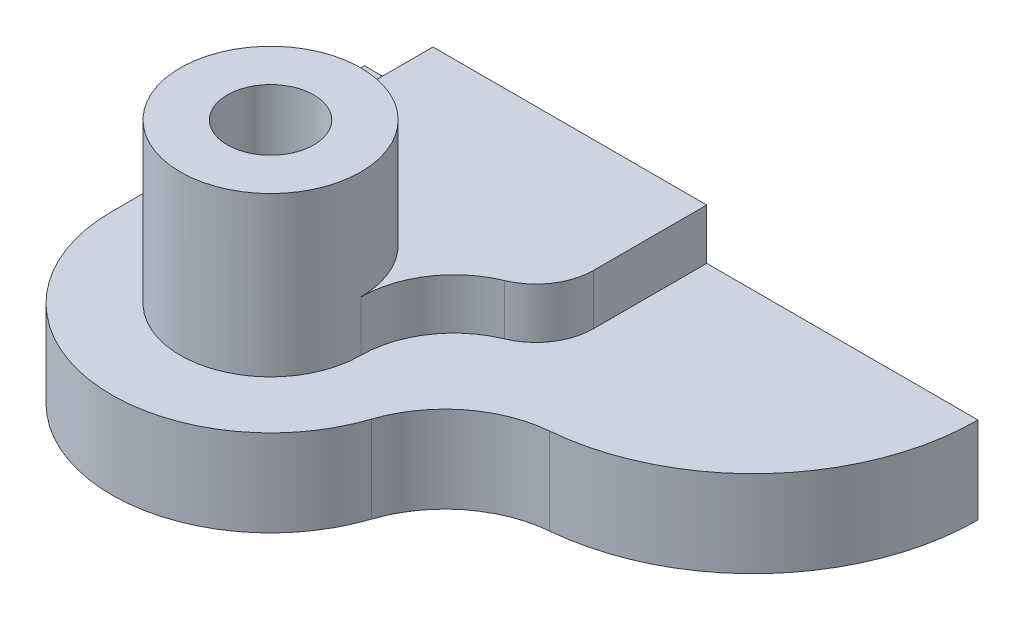
ISO-10303-21;
HEADER;
FILE_DESCRIPTION(('STEP AP214'),'2;1');
FILE_NAME('part.step','',(''),(''),'','','');
FILE_SCHEMA(('AUTOMOTIVE_DESIGN { 1 0 10303 214 1 1 1 1 }'));
ENDSEC;
DATA;
#1=APPLICATION_CONTEXT('core data for automotive mechanical design processes');
#2=APPLICATION_PROTOCOL_DEFINITION('international standard','automotive_design',2000,#1);
#3=PRODUCT_CONTEXT('',#1,'mechanical');
#4=PRODUCT('Part','Part','',(#3));
#5=PRODUCT_RELATED_PRODUCT_CATEGORY('part','',(#4));
#6=PRODUCT_DEFINITION_FORMATION('','',#4);
#7=PRODUCT_DEFINITION_CONTEXT('part definition',#1,'design');
#8=PRODUCT_DEFINITION('design','',#6,#7);
#9=PRODUCT_DEFINITION_SHAPE('','',#8);
#10=(LENGTH_UNIT() NAMED_UNIT(*) SI_UNIT(.MILLI.,.METRE.));
#11=(NAMED_UNIT(*) PLANE_ANGLE_UNIT() SI_UNIT($,.RADIAN.));
#12=(NAMED_UNIT(*) SI_UNIT($,.STERADIAN.) SOLID_ANGLE_UNIT());
#13=UNCERTAINTY_MEASURE_WITH_UNIT(LENGTH_MEASURE(1.E-05),#10,'distance_accuracy_value','');
#14=(GEOMETRIC_REPRESENTATION_CONTEXT(3) GLOBAL_UNCERTAINTY_ASSIGNED_CONTEXT((#13)) GLOBAL_UNIT_ASSIGNED_CONTEXT((#10,
#11,#12)) REPRESENTATION_CONTEXT('',''));
#15=CARTESIAN_POINT('',(0.,0.,0.));
#16=DIRECTION('',(0.,0.,1.));
#17=DIRECTION('',(1.,0.,0.));
#18=AXIS2_PLACEMENT_3D('',#15,#16,#17);
#19=CARTESIAN_POINT('',(-22.,12.,0.));
#20=DIRECTION('',(-1.,0.,0.));
#21=DIRECTION('',(0.,0.,1.));
#22=AXIS2_PLACEMENT_3D('',#19,#20,#21);
#23=PLANE('',#22);
#24=DIRECTION('',(0.,0.,-1.));
#25=VECTOR('',#24,1.);
#26=CARTESIAN_POINT('',(-22.,0.,0.));
#27=LINE('',#26,#25);
#28=CARTESIAN_POINT('',(-22.,0.,0.));
#29=VERTEX_POINT('',#28);
#30=CARTESIAN_POINT('',(-22.,0.,-35.));
#31=VERTEX_POINT('',#30);
#32=EDGE_CURVE('E131',#29,#31,#27,.T.);
#33=ORIENTED_EDGE('',*,*,#32,.F.);
#34=DIRECTION('',(0.,-1.,0.));
#35=VECTOR('',#34,1.);
#36=CARTESIAN_POINT('',(-22.,12.,0.));
#37=LINE('',#36,#35);
#38=CARTESIAN_POINT('',(-22.,12.,0.));
#39=VERTEX_POINT('',#38);
#40=EDGE_CURVE('E50',#39,#29,#37,.T.);
#41=ORIENTED_EDGE('',*,*,#40,.F.);
#42=DIRECTION('',(0.,0.,-1.));
#43=VECTOR('',#42,1.);
#44=CARTESIAN_POINT('',(-22.,12.,0.));
#45=LINE('',#44,#43);
#46=CARTESIAN_POINT('',(-22.,12.,-35.));
#47=VERTEX_POINT('',#46);
#48=EDGE_CURVE('E153',#39,#47,#45,.T.);
#49=ORIENTED_EDGE('',*,*,#48,.T.);
#50=DIRECTION('',(0.,-1.,0.));
#51=VECTOR('',#50,1.);
#52=CARTESIAN_POINT('',(-22.,12.,-35.));
#53=LINE('',#52,#51);
#54=EDGE_CURVE('E11',#47,#31,#53,.T.);
#55=ORIENTED_EDGE('',*,*,#54,.T.);
#56=EDGE_LOOP('',(#33,#41,#49,#55));
#57=FACE_BOUND('',#56,.T.);
#58=ADVANCED_FACE('F39',(#57),#23,.T.);
#59=CARTESIAN_POINT('',(0.,12.,0.));
#60=DIRECTION('',(0.,-1.,0.));
#61=DIRECTION('',(0.,0.,-1.));
#62=AXIS2_PLACEMENT_3D('',#59,#60,#61);
#63=CYLINDRICAL_SURFACE('',#62,22.);
#64=CARTESIAN_POINT('',(0.,0.,0.));
#65=DIRECTION('',(0.,1.,0.));
#66=DIRECTION('',(0.,0.,1.));
#67=AXIS2_PLACEMENT_3D('',#64,#65,#66);
#68=CIRCLE('',#67,22.);
#69=CARTESIAN_POINT('',(20.8864805611751,0.,6.91049417680477));
#70=VERTEX_POINT('',#69);
#71=EDGE_CURVE('E140',#29,#70,#68,.T.);
#72=ORIENTED_EDGE('',*,*,#71,.T.);
#73=DIRECTION('',(0.,-1.,0.));
#74=VECTOR('',#73,1.);
#75=CARTESIAN_POINT('',(20.8864805611751,12.,6.91049417680477));
#76=LINE('',#75,#74);
#77=CARTESIAN_POINT('',(20.8864805611751,12.,6.91049417680477));
#78=VERTEX_POINT('',#77);
#79=EDGE_CURVE('E115',#78,#70,#76,.T.);
#80=ORIENTED_EDGE('',*,*,#79,.F.);
#81=CARTESIAN_POINT('',(0.,12.,0.));
#82=DIRECTION('',(0.,1.,0.));
#83=DIRECTION('',(0.,0.,1.));
#84=AXIS2_PLACEMENT_3D('',#81,#82,#83);
#85=CIRCLE('',#84,22.);
#86=EDGE_CURVE('E116',#39,#78,#85,.T.);
#87=ORIENTED_EDGE('',*,*,#86,.F.);
#88=ORIENTED_EDGE('',*,*,#40,.T.);
#89=EDGE_LOOP('',(#72,#80,#87,#88));
#90=FACE_BOUND('',#89,.T.);
#91=ADVANCED_FACE('F148',(#90),#63,.T.);
#92=CARTESIAN_POINT('',(36.0766482420298,12.,11.9363081235719));
#93=DIRECTION('',(0.,-1.,0.));
#94=DIRECTION('',(0.,0.,-1.));
#95=AXIS2_PLACEMENT_3D('',#92,#93,#94);
#96=CYLINDRICAL_SURFACE('',#95,16.);
#97=CARTESIAN_POINT('',(36.0766482420298,0.,11.9363081235719));
#98=DIRECTION('',(0.,1.,0.));
#99=DIRECTION('',(0.,0.,1.));
#100=AXIS2_PLACEMENT_3D('',#97,#98,#99);
#101=CIRCLE('',#100,16.);
#102=CARTESIAN_POINT('',(34.6504352878827,0.,-4.));
#103=VERTEX_POINT('',#102);
#104=EDGE_CURVE('E109',#103,#70,#101,.T.);
#105=ORIENTED_EDGE('',*,*,#104,.F.);
#106=DIRECTION('',(0.,-1.,0.));
#107=VECTOR('',#106,1.);
#108=CARTESIAN_POINT('',(34.6504352878827,12.,-4.));
#109=LINE('',#108,#107);
#110=CARTESIAN_POINT('',(34.6504352878827,12.,-4.));
#111=VERTEX_POINT('',#110);
#112=EDGE_CURVE('E80',#111,#103,#109,.T.);
#113=ORIENTED_EDGE('',*,*,#112,.F.);
#114=CARTESIAN_POINT('',(36.0766482420298,12.,11.9363081235719));
#115=DIRECTION('',(0.,1.,0.));
#116=DIRECTION('',(0.,0.,1.));
#117=AXIS2_PLACEMENT_3D('',#114,#115,#116);
#118=CIRCLE('',#117,16.);
#119=EDGE_CURVE('E107',#111,#78,#118,.T.);
#120=ORIENTED_EDGE('',*,*,#119,.T.);
#121=ORIENTED_EDGE('',*,*,#79,.T.);
#122=EDGE_LOOP('',(#105,#113,#120,#121));
#123=FACE_BOUND('',#122,.T.);
#124=ADVANCED_FACE('F110',(#123),#96,.F.);
#125=CARTESIAN_POINT('',(31.8761037905416,12.,-35.));
#126=DIRECTION('',(0.,-1.,0.));
#127=DIRECTION('',(0.,0.,-1.));
#128=AXIS2_PLACEMENT_3D('',#125,#126,#127);
#129=CYLINDRICAL_SURFACE('',#128,31.1238962094584);
#130=CARTESIAN_POINT('',(31.8761037905416,0.,-35.));
#131=DIRECTION('',(0.,1.,0.));
#132=DIRECTION('',(0.,0.,1.));
#133=AXIS2_PLACEMENT_3D('',#130,#131,#132);
#134=CIRCLE('',#133,31.1238962094584);
#135=CARTESIAN_POINT('',(63.,0.,-35.));
#136=VERTEX_POINT('',#135);
#137=EDGE_CURVE('E134',#136,#103,#134,.F.);
#138=ORIENTED_EDGE('',*,*,#137,.F.);
#139=DIRECTION('',(0.,-1.,0.));
#140=VECTOR('',#139,1.);
#141=CARTESIAN_POINT('',(63.,12.,-35.));
#142=LINE('',#141,#140);
#143=CARTESIAN_POINT('',(63.,12.,-35.));
#144=VERTEX_POINT('',#143);
#145=EDGE_CURVE('E84',#144,#136,#142,.T.);
#146=ORIENTED_EDGE('',*,*,#145,.F.);
#147=CARTESIAN_POINT('',(31.8761037905416,12.,-35.));
#148=DIRECTION('',(0.,1.,0.));
#149=DIRECTION('',(0.,0.,1.));
#150=AXIS2_PLACEMENT_3D('',#147,#148,#149);
#151=CIRCLE('',#150,31.1238962094584);
#152=EDGE_CURVE('E117',#144,#111,#151,.F.);
#153=ORIENTED_EDGE('',*,*,#152,.T.);
#154=ORIENTED_EDGE('',*,*,#112,.T.);
#155=EDGE_LOOP('',(#138,#146,#153,#154));
#156=FACE_BOUND('',#155,.T.);
#157=ADVANCED_FACE('F125',(#156),#129,.T.);
#158=CARTESIAN_POINT('',(0.,12.,-35.));
#159=DIRECTION('',(0.,0.,-1.));
#160=DIRECTION('',(-1.,0.,0.));
#161=AXIS2_PLACEMENT_3D('',#158,#159,#160);
#162=PLANE('',#161);
#163=DIRECTION('',(1.,0.,0.));
#164=VECTOR('',#163,1.);
#165=CARTESIAN_POINT('',(0.,0.,-35.));
#166=LINE('',#165,#164);
#167=EDGE_CURVE('E128',#31,#136,#166,.T.);
#168=ORIENTED_EDGE('',*,*,#167,.F.);
#169=ORIENTED_EDGE('',*,*,#54,.F.);
#170=DIRECTION('',(1.,0.,0.));
#171=VECTOR('',#170,1.);
#172=CARTESIAN_POINT('',(0.,12.,-35.));
#173=LINE('',#172,#171);
#174=CARTESIAN_POINT('',(-12.5,12.,-35.));
#175=VERTEX_POINT('',#174);
#176=EDGE_CURVE('E127',#47,#175,#173,.T.);
#177=ORIENTED_EDGE('',*,*,#176,.T.);
#178=DIRECTION('',(0.,-1.,0.));
#179=VECTOR('',#178,1.);
#180=CARTESIAN_POINT('',(-12.5,19.,-35.));
#181=LINE('',#180,#179);
#182=CARTESIAN_POINT('',(-12.5,19.,-35.));
#183=VERTEX_POINT('',#182);
#184=EDGE_CURVE('E176',#183,#175,#181,.T.);
#185=ORIENTED_EDGE('',*,*,#184,.F.);
#186=DIRECTION('',(1.,0.,0.));
#187=VECTOR('',#186,1.);
#188=CARTESIAN_POINT('',(0.,19.,-35.));
#189=LINE('',#188,#187);
#190=CARTESIAN_POINT('',(25.4218583154685,19.,-35.));
#191=VERTEX_POINT('',#190);
#192=EDGE_CURVE('E194',#183,#191,#189,.T.);
#193=ORIENTED_EDGE('',*,*,#192,.T.);
#194=DIRECTION('',(0.,-1.,0.));
#195=VECTOR('',#194,1.);
#196=CARTESIAN_POINT('',(25.4218583154685,19.,-35.));
#197=LINE('',#196,#195);
#198=CARTESIAN_POINT('',(25.4218583154685,12.,-35.));
#199=VERTEX_POINT('',#198);
#200=EDGE_CURVE('E177',#191,#199,#197,.T.);
#201=ORIENTED_EDGE('',*,*,#200,.T.);
#202=EDGE_CURVE('E124',#199,#144,#173,.T.);
#203=ORIENTED_EDGE('',*,*,#202,.T.);
#204=ORIENTED_EDGE('',*,*,#145,.T.);
#205=EDGE_LOOP('',(#168,#169,#177,#185,#193,#201,#203,#204));
#206=FACE_BOUND('',#205,.T.);
#207=ADVANCED_FACE('F156',(#206),#162,.T.);
#208=CARTESIAN_POINT('',(0.,12.,0.));
#209=DIRECTION('',(0.,1.,0.));
#210=DIRECTION('',(0.,0.,1.));
#211=AXIS2_PLACEMENT_3D('',#208,#209,#210);
#212=PLANE('',#211);
#213=CARTESIAN_POINT('',(17.4218583154685,12.,-19.3319464972501));
#214=DIRECTION('',(0.,1.,0.));
#215=DIRECTION('',(0.,0.,1.));
#216=AXIS2_PLACEMENT_3D('',#213,#214,#215);
#217=CIRCLE('',#216,8.);
#218=CARTESIAN_POINT('',(20.4808600080993,12.,-11.9398893651331));
#219=VERTEX_POINT('',#218);
#220=CARTESIAN_POINT('',(25.4218583154685,12.,-19.3319464972501));
#221=VERTEX_POINT('',#220);
#222=EDGE_CURVE('E87',#219,#221,#217,.T.);
#223=ORIENTED_EDGE('',*,*,#222,.F.);
#224=CARTESIAN_POINT('',(25.4218583154685,12.,0.));
#225=DIRECTION('',(0.,1.,0.));
#226=DIRECTION('',(0.,0.,1.));
#227=AXIS2_PLACEMENT_3D('',#224,#225,#226);
#228=CIRCLE('',#227,12.9218583154685);
#229=CARTESIAN_POINT('',(12.5,12.,0.));
#230=VERTEX_POINT('',#229);
#231=EDGE_CURVE('E169',#230,#219,#228,.F.);
#232=ORIENTED_EDGE('',*,*,#231,.F.);
#233=CARTESIAN_POINT('',(0.,12.,0.));
#234=DIRECTION('',(0.,1.,0.));
#235=DIRECTION('',(0.,0.,1.));
#236=AXIS2_PLACEMENT_3D('',#233,#234,#235);
#237=CIRCLE('',#236,12.5);
#238=CARTESIAN_POINT('',(-12.5,12.,0.));
#239=VERTEX_POINT('',#238);
#240=EDGE_CURVE('E162',#239,#230,#237,.T.);
#241=ORIENTED_EDGE('',*,*,#240,.F.);
#242=DIRECTION('',(0.,0.,-1.));
#243=VECTOR('',#242,1.);
#244=CARTESIAN_POINT('',(-12.5,12.,0.));
#245=LINE('',#244,#243);
#246=EDGE_CURVE('E161',#239,#175,#245,.T.);
#247=ORIENTED_EDGE('',*,*,#246,.T.);
#248=ORIENTED_EDGE('',*,*,#176,.F.);
#249=ORIENTED_EDGE('',*,*,#48,.F.);
#250=ORIENTED_EDGE('',*,*,#86,.T.);
#251=ORIENTED_EDGE('',*,*,#119,.F.);
#252=ORIENTED_EDGE('',*,*,#152,.F.);
#253=ORIENTED_EDGE('',*,*,#202,.F.);
#254=DIRECTION('',(0.,0.,-1.));
#255=VECTOR('',#254,1.);
#256=CARTESIAN_POINT('',(25.4218583154685,12.,0.));
#257=LINE('',#256,#255);
#258=EDGE_CURVE('E54',#221,#199,#257,.T.);
#259=ORIENTED_EDGE('',*,*,#258,.F.);
#260=EDGE_LOOP('',(#223,#232,#241,#247,#248,#249,#250,#251,#252,#253,#259));
#261=FACE_BOUND('',#260,.T.);
#262=ADVANCED_FACE('F113',(#261),#212,.T.);
#263=CARTESIAN_POINT('',(0.,0.,0.));
#264=DIRECTION('',(0.,1.,0.));
#265=DIRECTION('',(0.,0.,1.));
#266=AXIS2_PLACEMENT_3D('',#263,#264,#265);
#267=PLANE('',#266);
#268=ORIENTED_EDGE('',*,*,#32,.T.);
#269=ORIENTED_EDGE('',*,*,#167,.T.);
#270=ORIENTED_EDGE('',*,*,#137,.T.);
#271=ORIENTED_EDGE('',*,*,#104,.T.);
#272=ORIENTED_EDGE('',*,*,#71,.F.);
#273=EDGE_LOOP('',(#268,#269,#270,#271,#272));
#274=FACE_BOUND('',#273,.T.);
#275=CARTESIAN_POINT('',(0.,0.,0.));
#276=DIRECTION('',(0.,1.,0.));
#277=DIRECTION('',(0.,0.,1.));
#278=AXIS2_PLACEMENT_3D('',#275,#276,#277);
#279=CIRCLE('',#278,6.);
#280=CARTESIAN_POINT('',(0.,0.,6.));
#281=VERTEX_POINT('',#280);
#282=EDGE_CURVE('E206',#281,#281,#279,.T.);
#283=ORIENTED_EDGE('',*,*,#282,.T.);
#284=EDGE_LOOP('',(#283));
#285=FACE_BOUND('',#284,.T.);
#286=ADVANCED_FACE('F151',(#274,#285),#267,.F.);
#287=CARTESIAN_POINT('',(25.4218583154685,19.,0.));
#288=DIRECTION('',(0.,-1.,0.));
#289=DIRECTION('',(0.,0.,-1.));
#290=AXIS2_PLACEMENT_3D('',#287,#288,#289);
#291=CYLINDRICAL_SURFACE('',#290,12.9218583154685);
#292=ORIENTED_EDGE('',*,*,#231,.T.);
#293=DIRECTION('',(0.,-1.,0.));
#294=VECTOR('',#293,1.);
#295=CARTESIAN_POINT('',(20.4808600080993,19.,-11.9398893651331));
#296=LINE('',#295,#294);
#297=CARTESIAN_POINT('',(20.4808600080993,19.,-11.9398893651331));
#298=VERTEX_POINT('',#297);
#299=EDGE_CURVE('E139',#298,#219,#296,.T.);
#300=ORIENTED_EDGE('',*,*,#299,.F.);
#301=CARTESIAN_POINT('',(25.4218583154685,19.,0.));
#302=DIRECTION('',(0.,1.,0.));
#303=DIRECTION('',(0.,0.,1.));
#304=AXIS2_PLACEMENT_3D('',#301,#302,#303);
#305=CIRCLE('',#304,12.9218583154685);
#306=CARTESIAN_POINT('',(12.5,19.,0.));
#307=VERTEX_POINT('',#306);
#308=EDGE_CURVE('E205',#307,#298,#305,.F.);
#309=ORIENTED_EDGE('',*,*,#308,.F.);
#310=DIRECTION('',(0.,-1.,0.));
#311=VECTOR('',#310,1.);
#312=CARTESIAN_POINT('',(12.5,19.,0.));
#313=LINE('',#312,#311);
#314=EDGE_CURVE('E184',#307,#230,#313,.T.);
#315=ORIENTED_EDGE('',*,*,#314,.T.);
#316=EDGE_LOOP('',(#292,#300,#309,#315));
#317=FACE_BOUND('',#316,.T.);
#318=ADVANCED_FACE('F246',(#317),#291,.F.);
#319=CARTESIAN_POINT('',(17.4218583154685,19.,-19.3319464972501));
#320=DIRECTION('',(0.,-1.,0.));
#321=DIRECTION('',(0.,0.,-1.));
#322=AXIS2_PLACEMENT_3D('',#319,#320,#321);
#323=CYLINDRICAL_SURFACE('',#322,8.);
#324=ORIENTED_EDGE('',*,*,#222,.T.);
#325=DIRECTION('',(0.,-1.,0.));
#326=VECTOR('',#325,1.);
#327=CARTESIAN_POINT('',(25.4218583154685,19.,-19.3319464972501));
#328=LINE('',#327,#326);
#329=CARTESIAN_POINT('',(25.4218583154685,19.,-19.3319464972501));
#330=VERTEX_POINT('',#329);
#331=EDGE_CURVE('E174',#330,#221,#328,.T.);
#332=ORIENTED_EDGE('',*,*,#331,.F.);
#333=CARTESIAN_POINT('',(17.4218583154685,19.,-19.3319464972501));
#334=DIRECTION('',(0.,1.,0.));
#335=DIRECTION('',(0.,0.,1.));
#336=AXIS2_PLACEMENT_3D('',#333,#334,#335);
#337=CIRCLE('',#336,8.);
#338=EDGE_CURVE('E200',#298,#330,#337,.T.);
#339=ORIENTED_EDGE('',*,*,#338,.F.);
#340=ORIENTED_EDGE('',*,*,#299,.T.);
#341=EDGE_LOOP('',(#324,#332,#339,#340));
#342=FACE_BOUND('',#341,.T.);
#343=ADVANCED_FACE('F255',(#342),#323,.T.);
#344=CARTESIAN_POINT('',(25.4218583154685,19.,0.));
#345=DIRECTION('',(-1.,0.,0.));
#346=DIRECTION('',(0.,0.,1.));
#347=AXIS2_PLACEMENT_3D('',#344,#345,#346);
#348=PLANE('',#347);
#349=ORIENTED_EDGE('',*,*,#258,.T.);
#350=ORIENTED_EDGE('',*,*,#200,.F.);
#351=DIRECTION('',(0.,0.,-1.));
#352=VECTOR('',#351,1.);
#353=CARTESIAN_POINT('',(25.4218583154685,19.,0.));
#354=LINE('',#353,#352);
#355=EDGE_CURVE('E198',#330,#191,#354,.T.);
#356=ORIENTED_EDGE('',*,*,#355,.F.);
#357=ORIENTED_EDGE('',*,*,#331,.T.);
#358=EDGE_LOOP('',(#349,#350,#356,#357));
#359=FACE_BOUND('',#358,.T.);
#360=ADVANCED_FACE('F256',(#359),#348,.F.);
#361=CARTESIAN_POINT('',(-12.5,19.,0.));
#362=DIRECTION('',(-1.,0.,0.));
#363=DIRECTION('',(0.,0.,1.));
#364=AXIS2_PLACEMENT_3D('',#361,#362,#363);
#365=PLANE('',#364);
#366=ORIENTED_EDGE('',*,*,#184,.T.);
#367=ORIENTED_EDGE('',*,*,#246,.F.);
#368=DIRECTION('',(0.,-1.,0.));
#369=VECTOR('',#368,1.);
#370=CARTESIAN_POINT('',(-12.5,19.,0.));
#371=LINE('',#370,#369);
#372=CARTESIAN_POINT('',(-12.5,19.,0.));
#373=VERTEX_POINT('',#372);
#374=EDGE_CURVE('E182',#373,#239,#371,.T.);
#375=ORIENTED_EDGE('',*,*,#374,.F.);
#376=DIRECTION('',(0.,0.,-1.));
#377=VECTOR('',#376,1.);
#378=CARTESIAN_POINT('',(-12.5,19.,0.));
#379=LINE('',#378,#377);
#380=EDGE_CURVE('E188',#373,#183,#379,.T.);
#381=ORIENTED_EDGE('',*,*,#380,.T.);
#382=EDGE_LOOP('',(#366,#367,#375,#381));
#383=FACE_BOUND('',#382,.T.);
#384=ADVANCED_FACE('F265',(#383),#365,.T.);
#385=CARTESIAN_POINT('',(0.,19.,0.));
#386=DIRECTION('',(0.,1.,0.));
#387=DIRECTION('',(0.,0.,1.));
#388=AXIS2_PLACEMENT_3D('',#385,#386,#387);
#389=PLANE('',#388);
#390=ORIENTED_EDGE('',*,*,#308,.T.);
#391=ORIENTED_EDGE('',*,*,#338,.T.);
#392=ORIENTED_EDGE('',*,*,#355,.T.);
#393=ORIENTED_EDGE('',*,*,#192,.F.);
#394=ORIENTED_EDGE('',*,*,#380,.F.);
#395=CARTESIAN_POINT('',(0.,19.,0.));
#396=DIRECTION('',(0.,1.,0.));
#397=DIRECTION('',(0.,0.,1.));
#398=AXIS2_PLACEMENT_3D('',#395,#396,#397);
#399=CIRCLE('',#398,12.5);
#400=EDGE_CURVE('E190',#307,#373,#399,.T.);
#401=ORIENTED_EDGE('',*,*,#400,.F.);
#402=EDGE_LOOP('',(#390,#391,#392,#393,#394,#401));
#403=FACE_BOUND('',#402,.T.);
#404=ADVANCED_FACE('F232',(#403),#389,.T.);
#405=CARTESIAN_POINT('',(0.,34.,0.));
#406=DIRECTION('',(0.,-1.,0.));
#407=DIRECTION('',(0.,0.,-1.));
#408=AXIS2_PLACEMENT_3D('',#405,#406,#407);
#409=CYLINDRICAL_SURFACE('',#408,6.);
#410=CARTESIAN_POINT('',(0.,34.,0.));
#411=DIRECTION('',(0.,1.,0.));
#412=DIRECTION('',(0.,0.,1.));
#413=AXIS2_PLACEMENT_3D('',#410,#411,#412);
#414=CIRCLE('',#413,6.);
#415=CARTESIAN_POINT('',(0.,34.,6.));
#416=VERTEX_POINT('',#415);
#417=EDGE_CURVE('E207',#416,#416,#414,.T.);
#418=ORIENTED_EDGE('',*,*,#417,.T.);
#419=EDGE_LOOP('',(#418));
#420=FACE_BOUND('',#419,.T.);
#421=ORIENTED_EDGE('',*,*,#282,.F.);
#422=EDGE_LOOP('',(#421));
#423=FACE_BOUND('',#422,.T.);
#424=ADVANCED_FACE('F214',(#420,#423),#409,.F.);
#425=CARTESIAN_POINT('',(0.,34.,0.));
#426=DIRECTION('',(0.,-1.,0.));
#427=DIRECTION('',(0.,0.,-1.));
#428=AXIS2_PLACEMENT_3D('',#425,#426,#427);
#429=CYLINDRICAL_SURFACE('',#428,12.5);
#430=ORIENTED_EDGE('',*,*,#314,.F.);
#431=ORIENTED_EDGE('',*,*,#400,.T.);
#432=ORIENTED_EDGE('',*,*,#374,.T.);
#433=ORIENTED_EDGE('',*,*,#240,.T.);
#434=EDGE_LOOP('',(#430,#431,#432,#433));
#435=FACE_BOUND('',#434,.T.);
#436=CARTESIAN_POINT('',(0.,34.,0.));
#437=DIRECTION('',(0.,1.,0.));
#438=DIRECTION('',(0.,0.,1.));
#439=AXIS2_PLACEMENT_3D('',#436,#437,#438);
#440=CIRCLE('',#439,12.5);
#441=CARTESIAN_POINT('',(0.,34.,12.5));
#442=VERTEX_POINT('',#441);
#443=EDGE_CURVE('E202',#442,#442,#440,.T.);
#444=ORIENTED_EDGE('',*,*,#443,.F.);
#445=EDGE_LOOP('',(#444));
#446=FACE_BOUND('',#445,.T.);
#447=ADVANCED_FACE('F222',(#435,#446),#429,.T.);
#448=CARTESIAN_POINT('',(0.,34.,0.));
#449=DIRECTION('',(0.,1.,0.));
#450=DIRECTION('',(0.,0.,1.));
#451=AXIS2_PLACEMENT_3D('',#448,#449,#450);
#452=PLANE('',#451);
#453=ORIENTED_EDGE('',*,*,#417,.F.);
#454=EDGE_LOOP('',(#453));
#455=FACE_BOUND('',#454,.T.);
#456=ORIENTED_EDGE('',*,*,#443,.T.);
#457=EDGE_LOOP('',(#456));
#458=FACE_BOUND('',#457,.T.);
#459=ADVANCED_FACE('F217',(#455,#458),#452,.T.);
#460=CLOSED_SHELL('',(#58,#91,#124,#157,#207,#262,#286,#318,#343,#360,#384,#404,#424,#447,#459));
#461=MANIFOLD_SOLID_BREP('B2',#460);
#462=ADVANCED_BREP_SHAPE_REPRESENTATION('',(#18,#461),#14);
#463=SHAPE_DEFINITION_REPRESENTATION(#9,#462);
ENDSEC;
END-ISO-10303-21;
